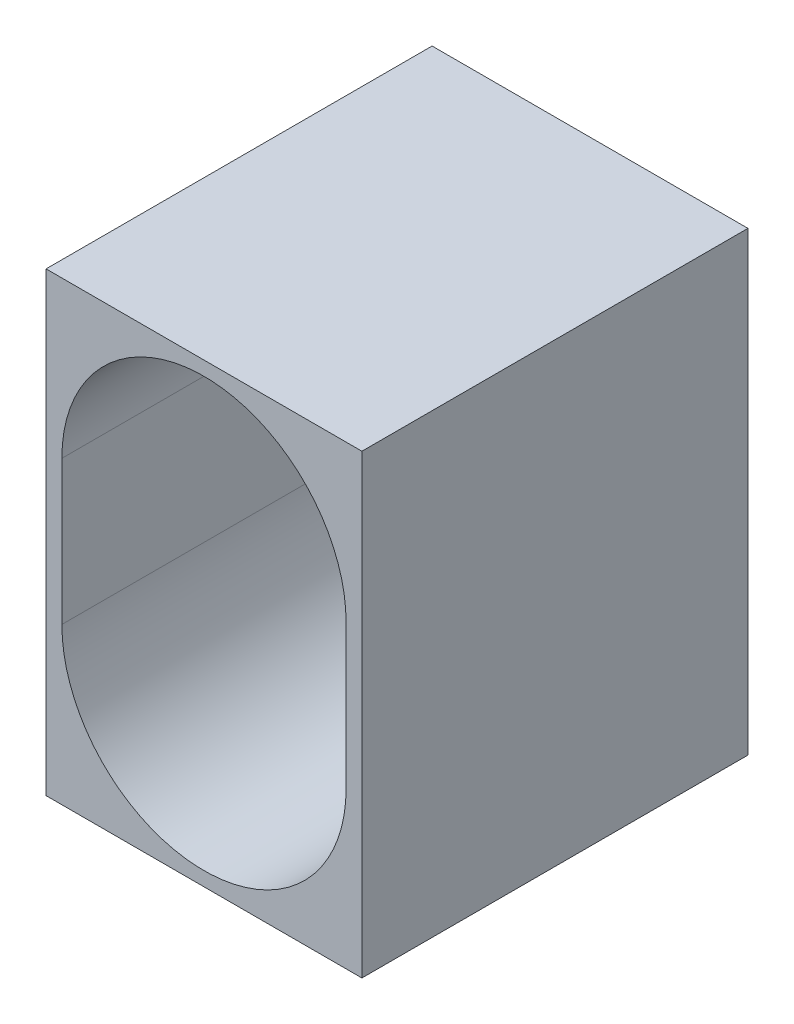
ISO-10303-21;
HEADER;
FILE_DESCRIPTION(('STEP AP214'),'2;1');
FILE_NAME('part.step','',(''),(''),'','','');
FILE_SCHEMA(('AUTOMOTIVE_DESIGN { 1 0 10303 214 1 1 1 1 }'));
ENDSEC;
DATA;
#1=APPLICATION_CONTEXT('core data for automotive mechanical design processes');
#2=APPLICATION_PROTOCOL_DEFINITION('international standard','automotive_design',2000,#1);
#3=PRODUCT_CONTEXT('',#1,'mechanical');
#4=PRODUCT('Part','Part','',(#3));
#5=PRODUCT_RELATED_PRODUCT_CATEGORY('part','',(#4));
#6=PRODUCT_DEFINITION_FORMATION('','',#4);
#7=PRODUCT_DEFINITION_CONTEXT('part definition',#1,'design');
#8=PRODUCT_DEFINITION('design','',#6,#7);
#9=PRODUCT_DEFINITION_SHAPE('','',#8);
#10=(LENGTH_UNIT() NAMED_UNIT(*) SI_UNIT(.MILLI.,.METRE.));
#11=(NAMED_UNIT(*) PLANE_ANGLE_UNIT() SI_UNIT($,.RADIAN.));
#12=(NAMED_UNIT(*) SI_UNIT($,.STERADIAN.) SOLID_ANGLE_UNIT());
#13=UNCERTAINTY_MEASURE_WITH_UNIT(LENGTH_MEASURE(1.E-05),#10,'distance_accuracy_value','');
#14=(GEOMETRIC_REPRESENTATION_CONTEXT(3) GLOBAL_UNCERTAINTY_ASSIGNED_CONTEXT((#13)) GLOBAL_UNIT_ASSIGNED_CONTEXT((#10,
#11,#12)) REPRESENTATION_CONTEXT('',''));
#15=CARTESIAN_POINT('',(0.,0.,0.));
#16=DIRECTION('',(0.,0.,1.));
#17=DIRECTION('',(1.,0.,0.));
#18=AXIS2_PLACEMENT_3D('',#15,#16,#17);
#19=CARTESIAN_POINT('',(-30.284904397773,20.560708190514,55.));
#20=DIRECTION('',(1.,0.,0.));
#21=DIRECTION('',(0.,1.,0.));
#22=AXIS2_PLACEMENT_3D('',#19,#20,#21);
#23=PLANE('',#22);
#24=DIRECTION('',(0.,-1.,0.));
#25=VECTOR('',#24,1.);
#26=CARTESIAN_POINT('',(-30.284904397773,20.560708190514,0.));
#27=LINE('',#26,#25);
#28=CARTESIAN_POINT('',(-30.284904397773,20.560708190514,0.));
#29=VERTEX_POINT('',#28);
#30=CARTESIAN_POINT('',(-30.2849043977729,-44.439291809486,0.));
#31=VERTEX_POINT('',#30);
#32=EDGE_CURVE('E188',#29,#31,#27,.T.);
#33=ORIENTED_EDGE('',*,*,#32,.T.);
#34=DIRECTION('',(0.,0.,-1.));
#35=VECTOR('',#34,1.);
#36=CARTESIAN_POINT('',(-30.2849043977729,-44.439291809486,55.));
#37=LINE('',#36,#35);
#38=CARTESIAN_POINT('',(-30.2849043977729,-44.439291809486,55.));
#39=VERTEX_POINT('',#38);
#40=EDGE_CURVE('E11',#39,#31,#37,.T.);
#41=ORIENTED_EDGE('',*,*,#40,.F.);
#42=DIRECTION('',(0.,-1.,0.));
#43=VECTOR('',#42,1.);
#44=CARTESIAN_POINT('',(-30.284904397773,20.560708190514,55.));
#45=LINE('',#44,#43);
#46=CARTESIAN_POINT('',(-30.284904397773,20.560708190514,55.));
#47=VERTEX_POINT('',#46);
#48=EDGE_CURVE('E197',#47,#39,#45,.T.);
#49=ORIENTED_EDGE('',*,*,#48,.F.);
#50=DIRECTION('',(0.,0.,-1.));
#51=VECTOR('',#50,1.);
#52=CARTESIAN_POINT('',(-30.284904397773,20.560708190514,55.));
#53=LINE('',#52,#51);
#54=EDGE_CURVE('E207',#47,#29,#53,.T.);
#55=ORIENTED_EDGE('',*,*,#54,.T.);
#56=EDGE_LOOP('',(#33,#41,#49,#55));
#57=FACE_BOUND('',#56,.T.);
#58=ADVANCED_FACE('F43',(#57),#23,.F.);
#59=CARTESIAN_POINT('',(-30.2849043977729,-44.439291809486,55.));
#60=DIRECTION('',(0.,1.,0.));
#61=DIRECTION('',(0.,0.,1.));
#62=AXIS2_PLACEMENT_3D('',#59,#60,#61);
#63=PLANE('',#62);
#64=DIRECTION('',(1.,0.,0.));
#65=VECTOR('',#64,1.);
#66=CARTESIAN_POINT('',(-30.2849043977729,-44.439291809486,0.));
#67=LINE('',#66,#65);
#68=CARTESIAN_POINT('',(14.7150956022271,-44.439291809486,0.));
#69=VERTEX_POINT('',#68);
#70=EDGE_CURVE('E211',#31,#69,#67,.T.);
#71=ORIENTED_EDGE('',*,*,#70,.T.);
#72=DIRECTION('',(0.,0.,-1.));
#73=VECTOR('',#72,1.);
#74=CARTESIAN_POINT('',(14.7150956022271,-44.439291809486,55.));
#75=LINE('',#74,#73);
#76=CARTESIAN_POINT('',(14.7150956022271,-44.439291809486,55.));
#77=VERTEX_POINT('',#76);
#78=EDGE_CURVE('E51',#77,#69,#75,.T.);
#79=ORIENTED_EDGE('',*,*,#78,.F.);
#80=DIRECTION('',(1.,0.,0.));
#81=VECTOR('',#80,1.);
#82=CARTESIAN_POINT('',(-30.2849043977729,-44.439291809486,55.));
#83=LINE('',#82,#81);
#84=EDGE_CURVE('E95',#39,#77,#83,.T.);
#85=ORIENTED_EDGE('',*,*,#84,.F.);
#86=ORIENTED_EDGE('',*,*,#40,.T.);
#87=EDGE_LOOP('',(#71,#79,#85,#86));
#88=FACE_BOUND('',#87,.T.);
#89=ADVANCED_FACE('F246',(#88),#63,.F.);
#90=CARTESIAN_POINT('',(14.715095602227,20.560708190514,55.));
#91=DIRECTION('',(-1.,0.,0.));
#92=DIRECTION('',(0.,-1.,0.));
#93=AXIS2_PLACEMENT_3D('',#90,#91,#92);
#94=PLANE('',#93);
#95=DIRECTION('',(0.,1.,0.));
#96=VECTOR('',#95,1.);
#97=CARTESIAN_POINT('',(14.715095602227,20.560708190514,0.));
#98=LINE('',#97,#96);
#99=CARTESIAN_POINT('',(14.715095602227,20.560708190514,0.));
#100=VERTEX_POINT('',#99);
#101=EDGE_CURVE('E214',#69,#100,#98,.T.);
#102=ORIENTED_EDGE('',*,*,#101,.T.);
#103=DIRECTION('',(0.,0.,-1.));
#104=VECTOR('',#103,1.);
#105=CARTESIAN_POINT('',(14.715095602227,20.560708190514,55.));
#106=LINE('',#105,#104);
#107=CARTESIAN_POINT('',(14.715095602227,20.560708190514,55.));
#108=VERTEX_POINT('',#107);
#109=EDGE_CURVE('E221',#108,#100,#106,.T.);
#110=ORIENTED_EDGE('',*,*,#109,.F.);
#111=DIRECTION('',(0.,1.,0.));
#112=VECTOR('',#111,1.);
#113=CARTESIAN_POINT('',(14.715095602227,20.560708190514,55.));
#114=LINE('',#113,#112);
#115=EDGE_CURVE('E202',#77,#108,#114,.T.);
#116=ORIENTED_EDGE('',*,*,#115,.F.);
#117=ORIENTED_EDGE('',*,*,#78,.T.);
#118=EDGE_LOOP('',(#102,#110,#116,#117));
#119=FACE_BOUND('',#118,.T.);
#120=ADVANCED_FACE('F228',(#119),#94,.F.);
#121=CARTESIAN_POINT('',(-30.284904397773,20.560708190514,55.));
#122=DIRECTION('',(0.,-1.,0.));
#123=DIRECTION('',(0.,0.,-1.));
#124=AXIS2_PLACEMENT_3D('',#121,#122,#123);
#125=PLANE('',#124);
#126=DIRECTION('',(-1.,0.,0.));
#127=VECTOR('',#126,1.);
#128=CARTESIAN_POINT('',(-30.284904397773,20.560708190514,0.));
#129=LINE('',#128,#127);
#130=EDGE_CURVE('E88',#100,#29,#129,.T.);
#131=ORIENTED_EDGE('',*,*,#130,.T.);
#132=ORIENTED_EDGE('',*,*,#54,.F.);
#133=DIRECTION('',(-1.,0.,0.));
#134=VECTOR('',#133,1.);
#135=CARTESIAN_POINT('',(-30.284904397773,20.560708190514,55.));
#136=LINE('',#135,#134);
#137=EDGE_CURVE('E67',#108,#47,#136,.T.);
#138=ORIENTED_EDGE('',*,*,#137,.F.);
#139=ORIENTED_EDGE('',*,*,#109,.T.);
#140=EDGE_LOOP('',(#131,#132,#138,#139));
#141=FACE_BOUND('',#140,.T.);
#142=ADVANCED_FACE('F236',(#141),#125,.F.);
#143=CARTESIAN_POINT('',(0.,0.,55.));
#144=DIRECTION('',(0.,0.,1.));
#145=DIRECTION('',(1.,0.,0.));
#146=AXIS2_PLACEMENT_3D('',#143,#144,#145);
#147=PLANE('',#146);
#148=CARTESIAN_POINT('',(-7.78490439777296,-22.189291809486,55.));
#149=DIRECTION('',(0.,0.,1.));
#150=DIRECTION('',(1.,0.,0.));
#151=AXIS2_PLACEMENT_3D('',#148,#149,#150);
#152=CIRCLE('',#151,20.25);
#153=CARTESIAN_POINT('',(-28.034904397773,-22.189291809486,55.));
#154=VERTEX_POINT('',#153);
#155=CARTESIAN_POINT('',(12.465095602227,-22.189291809486,55.));
#156=VERTEX_POINT('',#155);
#157=EDGE_CURVE('E58',#154,#156,#152,.T.);
#158=ORIENTED_EDGE('',*,*,#157,.F.);
#159=DIRECTION('',(0.,-1.,0.));
#160=VECTOR('',#159,1.);
#161=CARTESIAN_POINT('',(-28.034904397773,-22.189291809486,55.));
#162=LINE('',#161,#160);
#163=CARTESIAN_POINT('',(-28.034904397773,-1.68929180948604,55.));
#164=VERTEX_POINT('',#163);
#165=EDGE_CURVE('E159',#164,#154,#162,.T.);
#166=ORIENTED_EDGE('',*,*,#165,.F.);
#167=CARTESIAN_POINT('',(-7.78490439777296,-1.68929180948602,55.));
#168=DIRECTION('',(0.,0.,1.));
#169=DIRECTION('',(1.,0.,0.));
#170=AXIS2_PLACEMENT_3D('',#167,#168,#169);
#171=CIRCLE('',#170,20.25);
#172=CARTESIAN_POINT('',(12.465095602227,-1.689291809486,55.));
#173=VERTEX_POINT('',#172);
#174=EDGE_CURVE('E178',#173,#164,#171,.T.);
#175=ORIENTED_EDGE('',*,*,#174,.F.);
#176=DIRECTION('',(0.,1.,0.));
#177=VECTOR('',#176,1.);
#178=CARTESIAN_POINT('',(12.465095602227,-22.189291809486,55.));
#179=LINE('',#178,#177);
#180=EDGE_CURVE('E174',#156,#173,#179,.T.);
#181=ORIENTED_EDGE('',*,*,#180,.F.);
#182=EDGE_LOOP('',(#158,#166,#175,#181));
#183=FACE_BOUND('',#182,.T.);
#184=ORIENTED_EDGE('',*,*,#48,.T.);
#185=ORIENTED_EDGE('',*,*,#84,.T.);
#186=ORIENTED_EDGE('',*,*,#115,.T.);
#187=ORIENTED_EDGE('',*,*,#137,.T.);
#188=EDGE_LOOP('',(#184,#185,#186,#187));
#189=FACE_BOUND('',#188,.T.);
#190=ADVANCED_FACE('F238',(#183,#189),#147,.T.);
#191=CARTESIAN_POINT('',(0.,0.,0.));
#192=DIRECTION('',(0.,0.,1.));
#193=DIRECTION('',(1.,0.,0.));
#194=AXIS2_PLACEMENT_3D('',#191,#192,#193);
#195=PLANE('',#194);
#196=CARTESIAN_POINT('',(-26.2849043977729,-40.439291809486,0.));
#197=DIRECTION('',(0.,0.,-1.));
#198=DIRECTION('',(-1.,0.,0.));
#199=AXIS2_PLACEMENT_3D('',#196,#197,#198);
#200=CIRCLE('',#199,0.799999999999992);
#201=CARTESIAN_POINT('',(-27.0849043977729,-40.439291809486,0.));
#202=VERTEX_POINT('',#201);
#203=EDGE_CURVE('E133',#202,#202,#200,.T.);
#204=ORIENTED_EDGE('',*,*,#203,.F.);
#205=EDGE_LOOP('',(#204));
#206=FACE_BOUND('',#205,.T.);
#207=CARTESIAN_POINT('',(10.715095602227,-40.439291809486,0.));
#208=DIRECTION('',(0.,0.,-1.));
#209=DIRECTION('',(-1.,0.,0.));
#210=AXIS2_PLACEMENT_3D('',#207,#208,#209);
#211=CIRCLE('',#210,0.79999999999999);
#212=CARTESIAN_POINT('',(9.91509560222706,-40.439291809486,0.));
#213=VERTEX_POINT('',#212);
#214=EDGE_CURVE('E132',#213,#213,#211,.T.);
#215=ORIENTED_EDGE('',*,*,#214,.F.);
#216=EDGE_LOOP('',(#215));
#217=FACE_BOUND('',#216,.T.);
#218=CARTESIAN_POINT('',(-7.78490439777295,-16.439291809486,0.));
#219=DIRECTION('',(0.,0.,-1.));
#220=DIRECTION('',(-1.,0.,0.));
#221=AXIS2_PLACEMENT_3D('',#218,#219,#220);
#222=CIRCLE('',#221,2.70509999999999);
#223=CARTESIAN_POINT('',(-10.4900043977729,-16.439291809486,0.));
#224=VERTEX_POINT('',#223);
#225=EDGE_CURVE('E146',#224,#224,#222,.T.);
#226=ORIENTED_EDGE('',*,*,#225,.F.);
#227=EDGE_LOOP('',(#226));
#228=FACE_BOUND('',#227,.T.);
#229=ORIENTED_EDGE('',*,*,#32,.F.);
#230=ORIENTED_EDGE('',*,*,#130,.F.);
#231=ORIENTED_EDGE('',*,*,#101,.F.);
#232=ORIENTED_EDGE('',*,*,#70,.F.);
#233=EDGE_LOOP('',(#229,#230,#231,#232));
#234=FACE_BOUND('',#233,.T.);
#235=ADVANCED_FACE('F232',(#206,#217,#228,#234),#195,.F.);
#236=CARTESIAN_POINT('',(-7.78490439777296,-22.189291809486,2.5));
#237=DIRECTION('',(0.,0.,1.));
#238=DIRECTION('',(1.,0.,0.));
#239=AXIS2_PLACEMENT_3D('',#236,#237,#238);
#240=CYLINDRICAL_SURFACE('',#239,20.25);
#241=ORIENTED_EDGE('',*,*,#157,.T.);
#242=DIRECTION('',(0.,0.,1.));
#243=VECTOR('',#242,1.);
#244=CARTESIAN_POINT('',(12.465095602227,-22.189291809486,2.5));
#245=LINE('',#244,#243);
#246=CARTESIAN_POINT('',(12.465095602227,-22.189291809486,2.5));
#247=VERTEX_POINT('',#246);
#248=EDGE_CURVE('E171',#247,#156,#245,.T.);
#249=ORIENTED_EDGE('',*,*,#248,.F.);
#250=CARTESIAN_POINT('',(-7.78490439777296,-22.189291809486,2.5));
#251=DIRECTION('',(0.,0.,1.));
#252=DIRECTION('',(1.,0.,0.));
#253=AXIS2_PLACEMENT_3D('',#250,#251,#252);
#254=CIRCLE('',#253,20.25);
#255=CARTESIAN_POINT('',(-28.034904397773,-22.189291809486,2.5));
#256=VERTEX_POINT('',#255);
#257=EDGE_CURVE('E154',#256,#247,#254,.T.);
#258=ORIENTED_EDGE('',*,*,#257,.F.);
#259=DIRECTION('',(0.,0.,1.));
#260=VECTOR('',#259,1.);
#261=CARTESIAN_POINT('',(-28.034904397773,-22.189291809486,2.5));
#262=LINE('',#261,#260);
#263=EDGE_CURVE('E185',#256,#154,#262,.T.);
#264=ORIENTED_EDGE('',*,*,#263,.T.);
#265=EDGE_LOOP('',(#241,#249,#258,#264));
#266=FACE_BOUND('',#265,.T.);
#267=ADVANCED_FACE('F276',(#266),#240,.F.);
#268=CARTESIAN_POINT('',(-28.034904397773,-22.189291809486,2.5));
#269=DIRECTION('',(-1.,0.,0.));
#270=DIRECTION('',(0.,0.,1.));
#271=AXIS2_PLACEMENT_3D('',#268,#269,#270);
#272=PLANE('',#271);
#273=ORIENTED_EDGE('',*,*,#165,.T.);
#274=ORIENTED_EDGE('',*,*,#263,.F.);
#275=DIRECTION('',(0.,-1.,0.));
#276=VECTOR('',#275,1.);
#277=CARTESIAN_POINT('',(-28.034904397773,-22.189291809486,2.5));
#278=LINE('',#277,#276);
#279=CARTESIAN_POINT('',(-28.034904397773,-1.68929180948604,2.5));
#280=VERTEX_POINT('',#279);
#281=EDGE_CURVE('E167',#280,#256,#278,.T.);
#282=ORIENTED_EDGE('',*,*,#281,.F.);
#283=DIRECTION('',(0.,0.,1.));
#284=VECTOR('',#283,1.);
#285=CARTESIAN_POINT('',(-28.034904397773,-1.68929180948604,2.5));
#286=LINE('',#285,#284);
#287=EDGE_CURVE('E189',#280,#164,#286,.T.);
#288=ORIENTED_EDGE('',*,*,#287,.T.);
#289=EDGE_LOOP('',(#273,#274,#282,#288));
#290=FACE_BOUND('',#289,.T.);
#291=ADVANCED_FACE('F281',(#290),#272,.F.);
#292=CARTESIAN_POINT('',(-7.78490439777296,-1.68929180948602,2.5));
#293=DIRECTION('',(0.,0.,1.));
#294=DIRECTION('',(1.,0.,0.));
#295=AXIS2_PLACEMENT_3D('',#292,#293,#294);
#296=CYLINDRICAL_SURFACE('',#295,20.25);
#297=ORIENTED_EDGE('',*,*,#174,.T.);
#298=ORIENTED_EDGE('',*,*,#287,.F.);
#299=CARTESIAN_POINT('',(-7.78490439777296,-1.68929180948602,2.5));
#300=DIRECTION('',(0.,0.,1.));
#301=DIRECTION('',(1.,0.,0.));
#302=AXIS2_PLACEMENT_3D('',#299,#300,#301);
#303=CIRCLE('',#302,20.25);
#304=CARTESIAN_POINT('',(12.465095602227,-1.689291809486,2.5));
#305=VERTEX_POINT('',#304);
#306=EDGE_CURVE('E163',#305,#280,#303,.T.);
#307=ORIENTED_EDGE('',*,*,#306,.F.);
#308=DIRECTION('',(0.,0.,1.));
#309=VECTOR('',#308,1.);
#310=CARTESIAN_POINT('',(12.465095602227,-1.689291809486,2.5));
#311=LINE('',#310,#309);
#312=EDGE_CURVE('E192',#305,#173,#311,.T.);
#313=ORIENTED_EDGE('',*,*,#312,.T.);
#314=EDGE_LOOP('',(#297,#298,#307,#313));
#315=FACE_BOUND('',#314,.T.);
#316=ADVANCED_FACE('F290',(#315),#296,.F.);
#317=CARTESIAN_POINT('',(12.465095602227,-22.189291809486,2.5));
#318=DIRECTION('',(1.,0.,0.));
#319=DIRECTION('',(0.,1.,0.));
#320=AXIS2_PLACEMENT_3D('',#317,#318,#319);
#321=PLANE('',#320);
#322=ORIENTED_EDGE('',*,*,#180,.T.);
#323=ORIENTED_EDGE('',*,*,#312,.F.);
#324=DIRECTION('',(0.,1.,0.));
#325=VECTOR('',#324,1.);
#326=CARTESIAN_POINT('',(12.465095602227,-22.189291809486,2.5));
#327=LINE('',#326,#325);
#328=EDGE_CURVE('E158',#247,#305,#327,.T.);
#329=ORIENTED_EDGE('',*,*,#328,.F.);
#330=ORIENTED_EDGE('',*,*,#248,.T.);
#331=EDGE_LOOP('',(#322,#323,#329,#330));
#332=FACE_BOUND('',#331,.T.);
#333=ADVANCED_FACE('F300',(#332),#321,.F.);
#334=CARTESIAN_POINT('',(-7.78490439777296,-22.189291809486,2.5));
#335=DIRECTION('',(0.,0.,1.));
#336=DIRECTION('',(1.,0.,0.));
#337=AXIS2_PLACEMENT_3D('',#334,#335,#336);
#338=PLANE('',#337);
#339=CARTESIAN_POINT('',(-7.78490439777295,-16.439291809486,2.5));
#340=DIRECTION('',(0.,0.,1.));
#341=DIRECTION('',(1.,0.,0.));
#342=AXIS2_PLACEMENT_3D('',#339,#340,#341);
#343=CIRCLE('',#342,2.70509999999999);
#344=CARTESIAN_POINT('',(-5.07980439777296,-16.439291809486,2.5));
#345=VERTEX_POINT('',#344);
#346=EDGE_CURVE('E150',#345,#345,#343,.T.);
#347=ORIENTED_EDGE('',*,*,#346,.F.);
#348=EDGE_LOOP('',(#347));
#349=FACE_BOUND('',#348,.T.);
#350=ORIENTED_EDGE('',*,*,#257,.T.);
#351=ORIENTED_EDGE('',*,*,#328,.T.);
#352=ORIENTED_EDGE('',*,*,#306,.T.);
#353=ORIENTED_EDGE('',*,*,#281,.T.);
#354=EDGE_LOOP('',(#350,#351,#352,#353));
#355=FACE_BOUND('',#354,.T.);
#356=ADVANCED_FACE('F310',(#349,#355),#338,.T.);
#357=CARTESIAN_POINT('',(-7.78490439777295,-16.439291809486,0.));
#358=DIRECTION('',(0.,0.,-1.));
#359=DIRECTION('',(-1.,0.,0.));
#360=AXIS2_PLACEMENT_3D('',#357,#358,#359);
#361=CYLINDRICAL_SURFACE('',#360,2.70509999999999);
#362=ORIENTED_EDGE('',*,*,#225,.T.);
#363=EDGE_LOOP('',(#362));
#364=FACE_BOUND('',#363,.T.);
#365=ORIENTED_EDGE('',*,*,#346,.T.);
#366=EDGE_LOOP('',(#365));
#367=FACE_BOUND('',#366,.T.);
#368=ADVANCED_FACE('F320',(#364,#367),#361,.F.);
#369=CARTESIAN_POINT('',(10.715095602227,-40.439291809486,8.00000000000001));
#370=DIRECTION('',(0.,0.,-1.));
#371=DIRECTION('',(-1.,0.,0.));
#372=AXIS2_PLACEMENT_3D('',#369,#370,#371);
#373=CONICAL_SURFACE('',#372,0.799999999999988,1.02974425867665);
#374=CARTESIAN_POINT('',(10.715095602227,-40.439291809486,8.48068849522205));
#375=VERTEX_POINT('',#374);
#376=VERTEX_LOOP('',#375);
#377=FACE_BOUND('',#376,.T.);
#378=CARTESIAN_POINT('',(10.715095602227,-40.439291809486,8.00000000000001));
#379=DIRECTION('',(0.,0.,-1.));
#380=DIRECTION('',(-1.,0.,0.));
#381=AXIS2_PLACEMENT_3D('',#378,#379,#380);
#382=CIRCLE('',#381,0.799999999999988);
#383=CARTESIAN_POINT('',(9.91509560222706,-40.439291809486,8.00000000000001));
#384=VERTEX_POINT('',#383);
#385=EDGE_CURVE('E138',#384,#384,#382,.T.);
#386=ORIENTED_EDGE('',*,*,#385,.T.);
#387=EDGE_LOOP('',(#386));
#388=FACE_BOUND('',#387,.T.);
#389=ADVANCED_FACE('F331',(#377,#388),#373,.F.);
#390=CARTESIAN_POINT('',(10.715095602227,-40.439291809486,0.));
#391=DIRECTION('',(0.,0.,-1.));
#392=DIRECTION('',(-1.,0.,0.));
#393=AXIS2_PLACEMENT_3D('',#390,#391,#392);
#394=CYLINDRICAL_SURFACE('',#393,0.799999999999989);
#395=ORIENTED_EDGE('',*,*,#385,.F.);
#396=EDGE_LOOP('',(#395));
#397=FACE_BOUND('',#396,.T.);
#398=ORIENTED_EDGE('',*,*,#214,.T.);
#399=EDGE_LOOP('',(#398));
#400=FACE_BOUND('',#399,.T.);
#401=ADVANCED_FACE('F125',(#397,#400),#394,.F.);
#402=CARTESIAN_POINT('',(-26.2849043977729,-40.439291809486,7.99999999999999));
#403=DIRECTION('',(0.,0.,-1.));
#404=DIRECTION('',(-1.,0.,0.));
#405=AXIS2_PLACEMENT_3D('',#402,#403,#404);
#406=CONICAL_SURFACE('',#405,0.799999999999988,1.02974425867664);
#407=CARTESIAN_POINT('',(-26.284904397773,-40.439291809486,8.48068849522205));
#408=VERTEX_POINT('',#407);
#409=VERTEX_LOOP('',#408);
#410=FACE_BOUND('',#409,.T.);
#411=CARTESIAN_POINT('',(-26.2849043977729,-40.439291809486,7.99999999999999));
#412=DIRECTION('',(0.,0.,-1.));
#413=DIRECTION('',(-1.,0.,0.));
#414=AXIS2_PLACEMENT_3D('',#411,#412,#413);
#415=CIRCLE('',#414,0.799999999999988);
#416=CARTESIAN_POINT('',(-27.0849043977729,-40.439291809486,7.99999999999999));
#417=VERTEX_POINT('',#416);
#418=EDGE_CURVE('E129',#417,#417,#415,.T.);
#419=ORIENTED_EDGE('',*,*,#418,.T.);
#420=EDGE_LOOP('',(#419));
#421=FACE_BOUND('',#420,.T.);
#422=ADVANCED_FACE('F121',(#410,#421),#406,.F.);
#423=CARTESIAN_POINT('',(-26.2849043977729,-40.439291809486,0.));
#424=DIRECTION('',(0.,0.,-1.));
#425=DIRECTION('',(-1.,0.,0.));
#426=AXIS2_PLACEMENT_3D('',#423,#424,#425);
#427=CYLINDRICAL_SURFACE('',#426,0.79999999999999);
#428=ORIENTED_EDGE('',*,*,#418,.F.);
#429=EDGE_LOOP('',(#428));
#430=FACE_BOUND('',#429,.T.);
#431=ORIENTED_EDGE('',*,*,#203,.T.);
#432=EDGE_LOOP('',(#431));
#433=FACE_BOUND('',#432,.T.);
#434=ADVANCED_FACE('F124',(#430,#433),#427,.F.);
#435=CLOSED_SHELL('',(#58,#89,#120,#142,#190,#235,#267,#291,#316,#333,#356,#368,#389,#401,#422,#434));
#436=MANIFOLD_SOLID_BREP('B2',#435);
#437=ADVANCED_BREP_SHAPE_REPRESENTATION('',(#18,#436),#14);
#438=SHAPE_DEFINITION_REPRESENTATION(#9,#437);
ENDSEC;
END-ISO-10303-21;
